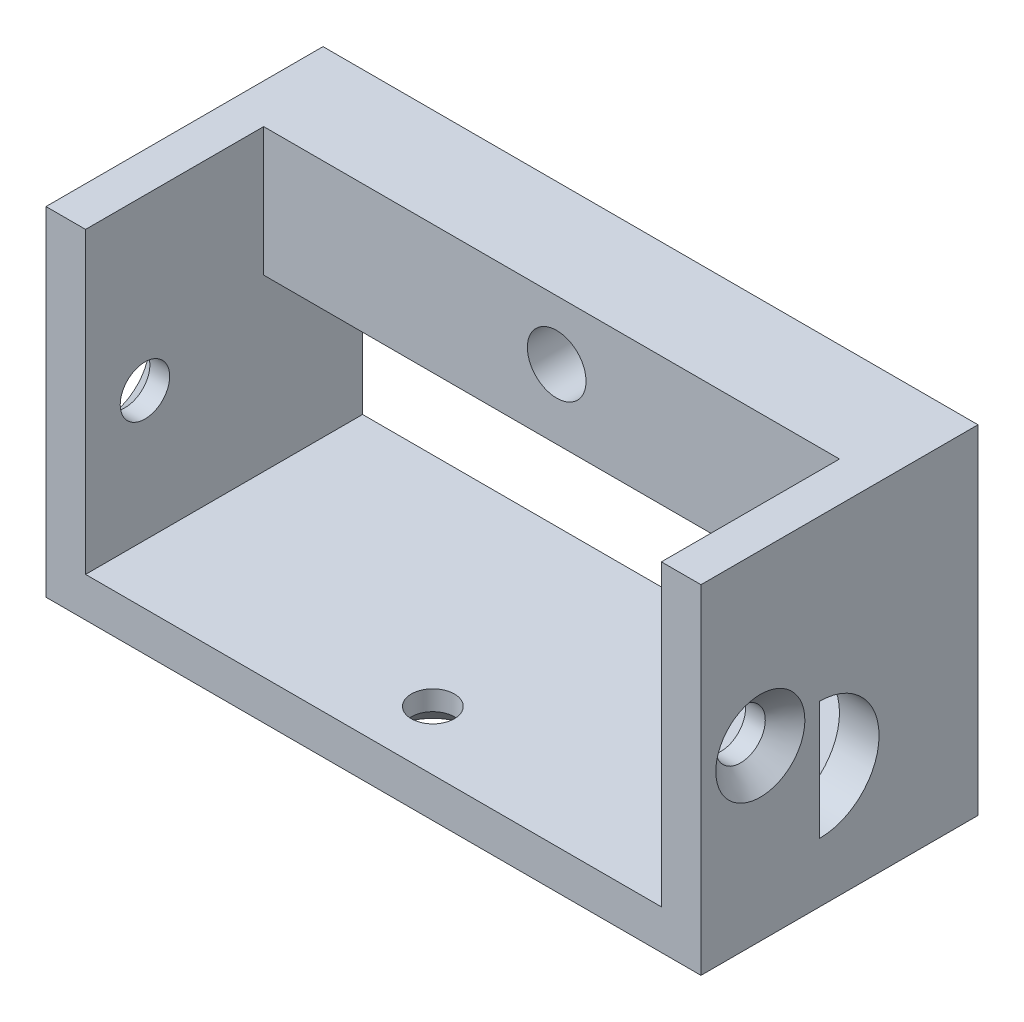
ISO-10303-21;
HEADER;
FILE_DESCRIPTION(('STEP AP214'),'2;1');
FILE_NAME('part.step','',(''),(''),'','','');
FILE_SCHEMA(('AUTOMOTIVE_DESIGN { 1 0 10303 214 1 1 1 1 }'));
ENDSEC;
DATA;
#1=APPLICATION_CONTEXT('core data for automotive mechanical design processes');
#2=APPLICATION_PROTOCOL_DEFINITION('international standard','automotive_design',2000,#1);
#3=PRODUCT_CONTEXT('',#1,'mechanical');
#4=PRODUCT('Part','Part','',(#3));
#5=PRODUCT_RELATED_PRODUCT_CATEGORY('part','',(#4));
#6=PRODUCT_DEFINITION_FORMATION('','',#4);
#7=PRODUCT_DEFINITION_CONTEXT('part definition',#1,'design');
#8=PRODUCT_DEFINITION('design','',#6,#7);
#9=PRODUCT_DEFINITION_SHAPE('','',#8);
#10=(LENGTH_UNIT() NAMED_UNIT(*) SI_UNIT(.MILLI.,.METRE.));
#11=(NAMED_UNIT(*) PLANE_ANGLE_UNIT() SI_UNIT($,.RADIAN.));
#12=(NAMED_UNIT(*) SI_UNIT($,.STERADIAN.) SOLID_ANGLE_UNIT());
#13=UNCERTAINTY_MEASURE_WITH_UNIT(LENGTH_MEASURE(1.E-05),#10,'distance_accuracy_value','');
#14=(GEOMETRIC_REPRESENTATION_CONTEXT(3) GLOBAL_UNCERTAINTY_ASSIGNED_CONTEXT((#13)) GLOBAL_UNIT_ASSIGNED_CONTEXT((#10,
#11,#12)) REPRESENTATION_CONTEXT('',''));
#15=CARTESIAN_POINT('',(0.,0.,0.));
#16=DIRECTION('',(0.,0.,1.));
#17=DIRECTION('',(1.,0.,0.));
#18=AXIS2_PLACEMENT_3D('',#15,#16,#17);
#19=CARTESIAN_POINT('',(0.,6.5,5.));
#20=DIRECTION('',(0.,-1.,0.));
#21=DIRECTION('',(1.,0.,0.));
#22=AXIS2_PLACEMENT_3D('',#19,#20,#21);
#23=PLANE('',#22);
#24=DIRECTION('',(-1.,0.,0.));
#25=VECTOR('',#24,1.);
#26=CARTESIAN_POINT('',(0.,6.5,0.));
#27=LINE('',#26,#25);
#28=CARTESIAN_POINT('',(2.,6.5,0.));
#29=VERTEX_POINT('',#28);
#30=CARTESIAN_POINT('',(-31.1,6.5,0.));
#31=VERTEX_POINT('',#30);
#32=EDGE_CURVE('E195',#29,#31,#27,.T.);
#33=ORIENTED_EDGE('',*,*,#32,.T.);
#34=DIRECTION('',(0.,0.,-1.));
#35=VECTOR('',#34,1.);
#36=CARTESIAN_POINT('',(-31.1,6.5,8.));
#37=LINE('',#36,#35);
#38=CARTESIAN_POINT('',(-31.1,6.5,14.));
#39=VERTEX_POINT('',#38);
#40=EDGE_CURVE('E192',#39,#31,#37,.T.);
#41=ORIENTED_EDGE('',*,*,#40,.F.);
#42=DIRECTION('',(-1.,0.,0.));
#43=VECTOR('',#42,1.);
#44=CARTESIAN_POINT('',(-31.1,6.5,14.));
#45=LINE('',#44,#43);
#46=CARTESIAN_POINT('',(-29.1,6.5,14.));
#47=VERTEX_POINT('',#46);
#48=EDGE_CURVE('E160',#47,#39,#45,.T.);
#49=ORIENTED_EDGE('',*,*,#48,.F.);
#50=DIRECTION('',(0.,0.,-1.));
#51=VECTOR('',#50,1.);
#52=CARTESIAN_POINT('',(-29.1,6.5,8.));
#53=LINE('',#52,#51);
#54=CARTESIAN_POINT('',(-29.1,6.5,5.));
#55=VERTEX_POINT('',#54);
#56=EDGE_CURVE('E203',#47,#55,#53,.T.);
#57=ORIENTED_EDGE('',*,*,#56,.T.);
#58=DIRECTION('',(-1.,0.,0.));
#59=VECTOR('',#58,1.);
#60=CARTESIAN_POINT('',(0.,6.5,5.));
#61=LINE('',#60,#59);
#62=CARTESIAN_POINT('',(0.,6.5,5.));
#63=VERTEX_POINT('',#62);
#64=EDGE_CURVE('E127',#63,#55,#61,.T.);
#65=ORIENTED_EDGE('',*,*,#64,.F.);
#66=DIRECTION('',(0.,0.,-1.));
#67=VECTOR('',#66,1.);
#68=CARTESIAN_POINT('',(0.,6.5,8.));
#69=LINE('',#68,#67);
#70=CARTESIAN_POINT('',(0.,6.5,14.));
#71=VERTEX_POINT('',#70);
#72=EDGE_CURVE('E121',#71,#63,#69,.T.);
#73=ORIENTED_EDGE('',*,*,#72,.F.);
#74=DIRECTION('',(-1.,0.,0.));
#75=VECTOR('',#74,1.);
#76=CARTESIAN_POINT('',(0.,6.5,14.));
#77=LINE('',#76,#75);
#78=CARTESIAN_POINT('',(2.,6.5,14.));
#79=VERTEX_POINT('',#78);
#80=EDGE_CURVE('E125',#79,#71,#77,.T.);
#81=ORIENTED_EDGE('',*,*,#80,.F.);
#82=DIRECTION('',(0.,0.,-1.));
#83=VECTOR('',#82,1.);
#84=CARTESIAN_POINT('',(2.,6.5,8.));
#85=LINE('',#84,#83);
#86=EDGE_CURVE('E130',#79,#29,#85,.T.);
#87=ORIENTED_EDGE('',*,*,#86,.T.);
#88=EDGE_LOOP('',(#33,#41,#49,#57,#65,#73,#81,#87));
#89=FACE_BOUND('',#88,.T.);
#90=ADVANCED_FACE('F36',(#89),#23,.F.);
#91=CARTESIAN_POINT('',(0.,0.,5.));
#92=DIRECTION('',(0.,1.,0.));
#93=DIRECTION('',(-1.,0.,0.));
#94=AXIS2_PLACEMENT_3D('',#91,#92,#93);
#95=PLANE('',#94);
#96=DIRECTION('',(1.,0.,0.));
#97=VECTOR('',#96,1.);
#98=CARTESIAN_POINT('',(0.,0.,0.));
#99=LINE('',#98,#97);
#100=CARTESIAN_POINT('',(-29.1,0.,0.));
#101=VERTEX_POINT('',#100);
#102=CARTESIAN_POINT('',(0.,0.,0.));
#103=VERTEX_POINT('',#102);
#104=EDGE_CURVE('E209',#101,#103,#99,.T.);
#105=ORIENTED_EDGE('',*,*,#104,.T.);
#106=DIRECTION('',(0.,0.,-1.));
#107=VECTOR('',#106,1.);
#108=CARTESIAN_POINT('',(0.,0.,5.));
#109=LINE('',#108,#107);
#110=CARTESIAN_POINT('',(0.,0.,5.));
#111=VERTEX_POINT('',#110);
#112=EDGE_CURVE('E214',#111,#103,#109,.T.);
#113=ORIENTED_EDGE('',*,*,#112,.F.);
#114=DIRECTION('',(1.,0.,0.));
#115=VECTOR('',#114,1.);
#116=CARTESIAN_POINT('',(0.,0.,5.));
#117=LINE('',#116,#115);
#118=CARTESIAN_POINT('',(-29.1,0.,5.));
#119=VERTEX_POINT('',#118);
#120=EDGE_CURVE('E52',#119,#111,#117,.T.);
#121=ORIENTED_EDGE('',*,*,#120,.F.);
#122=DIRECTION('',(0.,0.,-1.));
#123=VECTOR('',#122,1.);
#124=CARTESIAN_POINT('',(-29.1,0.,5.));
#125=LINE('',#124,#123);
#126=EDGE_CURVE('E220',#119,#101,#125,.T.);
#127=ORIENTED_EDGE('',*,*,#126,.T.);
#128=EDGE_LOOP('',(#105,#113,#121,#127));
#129=FACE_BOUND('',#128,.T.);
#130=ADVANCED_FACE('F266',(#129),#95,.F.);
#131=CARTESIAN_POINT('',(0.,0.,5.));
#132=DIRECTION('',(0.,0.,1.));
#133=DIRECTION('',(1.,0.,0.));
#134=AXIS2_PLACEMENT_3D('',#131,#132,#133);
#135=PLANE('',#134);
#136=CARTESIAN_POINT('',(-14.2908017761604,3.5,5.));
#137=DIRECTION('',(0.,0.,-1.));
#138=DIRECTION('',(-1.,0.,0.));
#139=AXIS2_PLACEMENT_3D('',#136,#137,#138);
#140=CIRCLE('',#139,1.48209069185977);
#141=CARTESIAN_POINT('',(-15.7728924680202,3.5,5.));
#142=VERTEX_POINT('',#141);
#143=EDGE_CURVE('E246',#142,#142,#140,.T.);
#144=ORIENTED_EDGE('',*,*,#143,.T.);
#145=EDGE_LOOP('',(#144));
#146=FACE_BOUND('',#145,.T.);
#147=DIRECTION('',(0.,1.,0.));
#148=VECTOR('',#147,1.);
#149=CARTESIAN_POINT('',(0.,0.,5.));
#150=LINE('',#149,#148);
#151=EDGE_CURVE('E207',#111,#63,#150,.T.);
#152=ORIENTED_EDGE('',*,*,#151,.T.);
#153=ORIENTED_EDGE('',*,*,#64,.T.);
#154=DIRECTION('',(0.,-1.,0.));
#155=VECTOR('',#154,1.);
#156=CARTESIAN_POINT('',(-29.1,0.,5.));
#157=LINE('',#156,#155);
#158=EDGE_CURVE('E211',#55,#119,#157,.T.);
#159=ORIENTED_EDGE('',*,*,#158,.T.);
#160=ORIENTED_EDGE('',*,*,#120,.T.);
#161=EDGE_LOOP('',(#152,#153,#159,#160));
#162=FACE_BOUND('',#161,.T.);
#163=ADVANCED_FACE('F271',(#146,#162),#135,.T.);
#164=CARTESIAN_POINT('',(0.,0.,0.));
#165=DIRECTION('',(0.,0.,1.));
#166=DIRECTION('',(1.,0.,0.));
#167=AXIS2_PLACEMENT_3D('',#164,#165,#166);
#168=PLANE('',#167);
#169=CARTESIAN_POINT('',(-14.2908017761604,3.5,0.));
#170=DIRECTION('',(0.,0.,1.));
#171=DIRECTION('',(1.,0.,0.));
#172=AXIS2_PLACEMENT_3D('',#169,#170,#171);
#173=CIRCLE('',#172,2.48209069185978);
#174=CARTESIAN_POINT('',(-11.8087110843006,3.5,0.));
#175=VERTEX_POINT('',#174);
#176=EDGE_CURVE('E11',#175,#175,#173,.T.);
#177=ORIENTED_EDGE('',*,*,#176,.T.);
#178=EDGE_LOOP('',(#177));
#179=FACE_BOUND('',#178,.T.);
#180=ORIENTED_EDGE('',*,*,#32,.F.);
#181=DIRECTION('',(0.,-1.,0.));
#182=VECTOR('',#181,1.);
#183=CARTESIAN_POINT('',(2.,0.,0.));
#184=LINE('',#183,#182);
#185=CARTESIAN_POINT('',(2.,-10.6,0.));
#186=VERTEX_POINT('',#185);
#187=EDGE_CURVE('E186',#29,#186,#184,.T.);
#188=ORIENTED_EDGE('',*,*,#187,.T.);
#189=DIRECTION('',(-1.,0.,0.));
#190=VECTOR('',#189,1.);
#191=CARTESIAN_POINT('',(0.,-10.6,0.));
#192=LINE('',#191,#190);
#193=CARTESIAN_POINT('',(-31.1,-10.6,0.));
#194=VERTEX_POINT('',#193);
#195=EDGE_CURVE('E189',#186,#194,#192,.T.);
#196=ORIENTED_EDGE('',*,*,#195,.T.);
#197=DIRECTION('',(0.,-1.,0.));
#198=VECTOR('',#197,1.);
#199=CARTESIAN_POINT('',(-31.1,0.,0.));
#200=LINE('',#199,#198);
#201=EDGE_CURVE('E176',#31,#194,#200,.T.);
#202=ORIENTED_EDGE('',*,*,#201,.F.);
#203=EDGE_LOOP('',(#180,#188,#196,#202));
#204=FACE_BOUND('',#203,.T.);
#205=DIRECTION('',(0.,-1.,0.));
#206=VECTOR('',#205,1.);
#207=CARTESIAN_POINT('',(0.,0.,0.));
#208=LINE('',#207,#206);
#209=CARTESIAN_POINT('',(0.,-8.6,0.));
#210=VERTEX_POINT('',#209);
#211=EDGE_CURVE('E184',#103,#210,#208,.T.);
#212=ORIENTED_EDGE('',*,*,#211,.F.);
#213=ORIENTED_EDGE('',*,*,#104,.F.);
#214=DIRECTION('',(0.,1.,0.));
#215=VECTOR('',#214,1.);
#216=CARTESIAN_POINT('',(-29.1,0.,0.));
#217=LINE('',#216,#215);
#218=CARTESIAN_POINT('',(-29.1,-8.6,0.));
#219=VERTEX_POINT('',#218);
#220=EDGE_CURVE('E179',#219,#101,#217,.T.);
#221=ORIENTED_EDGE('',*,*,#220,.F.);
#222=DIRECTION('',(-1.,0.,0.));
#223=VECTOR('',#222,1.);
#224=CARTESIAN_POINT('',(0.,-8.6,0.));
#225=LINE('',#224,#223);
#226=EDGE_CURVE('E182',#210,#219,#225,.T.);
#227=ORIENTED_EDGE('',*,*,#226,.F.);
#228=EDGE_LOOP('',(#212,#213,#221,#227));
#229=FACE_BOUND('',#228,.T.);
#230=ADVANCED_FACE('F312',(#179,#204,#229),#168,.F.);
#231=CARTESIAN_POINT('',(0.,0.,8.));
#232=DIRECTION('',(1.,0.,0.));
#233=DIRECTION('',(0.,1.,0.));
#234=AXIS2_PLACEMENT_3D('',#231,#232,#233);
#235=PLANE('',#234);
#236=CARTESIAN_POINT('',(0.,-2.05,11.));
#237=DIRECTION('',(1.,0.,0.));
#238=DIRECTION('',(0.,1.,0.));
#239=AXIS2_PLACEMENT_3D('',#236,#237,#238);
#240=CIRCLE('',#239,1.25);
#241=CARTESIAN_POINT('',(0.,-0.800000000000004,11.));
#242=VERTEX_POINT('',#241);
#243=EDGE_CURVE('E153',#242,#242,#240,.T.);
#244=ORIENTED_EDGE('',*,*,#243,.T.);
#245=EDGE_LOOP('',(#244));
#246=FACE_BOUND('',#245,.T.);
#247=CARTESIAN_POINT('',(0.,-4.60000000000001,8.));
#248=DIRECTION('',(1.,0.,0.));
#249=DIRECTION('',(0.,1.,0.));
#250=AXIS2_PLACEMENT_3D('',#247,#248,#249);
#251=CIRCLE('',#250,3.);
#252=CARTESIAN_POINT('',(0.,-7.60000000000001,8.));
#253=VERTEX_POINT('',#252);
#254=CARTESIAN_POINT('',(0.,-1.60000000000001,8.));
#255=VERTEX_POINT('',#254);
#256=EDGE_CURVE('E173',#253,#255,#251,.T.);
#257=ORIENTED_EDGE('',*,*,#256,.T.);
#258=DIRECTION('',(0.,-1.,0.));
#259=VECTOR('',#258,1.);
#260=CARTESIAN_POINT('',(0.,-8.6,8.));
#261=LINE('',#260,#259);
#262=EDGE_CURVE('E150',#255,#253,#261,.T.);
#263=ORIENTED_EDGE('',*,*,#262,.T.);
#264=EDGE_LOOP('',(#257,#263));
#265=FACE_BOUND('',#264,.T.);
#266=DIRECTION('',(0.,0.,-1.));
#267=VECTOR('',#266,1.);
#268=CARTESIAN_POINT('',(0.,-8.6,8.));
#269=LINE('',#268,#267);
#270=CARTESIAN_POINT('',(0.,-8.6,14.));
#271=VERTEX_POINT('',#270);
#272=EDGE_CURVE('E131',#271,#210,#269,.T.);
#273=ORIENTED_EDGE('',*,*,#272,.F.);
#274=DIRECTION('',(0.,-1.,0.));
#275=VECTOR('',#274,1.);
#276=CARTESIAN_POINT('',(0.,-8.6,14.));
#277=LINE('',#276,#275);
#278=EDGE_CURVE('E134',#71,#271,#277,.T.);
#279=ORIENTED_EDGE('',*,*,#278,.F.);
#280=ORIENTED_EDGE('',*,*,#72,.T.);
#281=ORIENTED_EDGE('',*,*,#151,.F.);
#282=ORIENTED_EDGE('',*,*,#112,.T.);
#283=ORIENTED_EDGE('',*,*,#211,.T.);
#284=EDGE_LOOP('',(#273,#279,#280,#281,#282,#283));
#285=FACE_BOUND('',#284,.T.);
#286=ADVANCED_FACE('F135',(#246,#265,#285),#235,.F.);
#287=CARTESIAN_POINT('',(-29.1,0.,8.));
#288=DIRECTION('',(-1.,0.,0.));
#289=DIRECTION('',(0.,0.,1.));
#290=AXIS2_PLACEMENT_3D('',#287,#288,#289);
#291=PLANE('',#290);
#292=CARTESIAN_POINT('',(-29.1,-2.05,11.));
#293=DIRECTION('',(-1.,0.,0.));
#294=DIRECTION('',(0.,0.,1.));
#295=AXIS2_PLACEMENT_3D('',#292,#293,#294);
#296=CIRCLE('',#295,1.25);
#297=CARTESIAN_POINT('',(-29.1,-2.05,12.25));
#298=VERTEX_POINT('',#297);
#299=EDGE_CURVE('E245',#298,#298,#296,.T.);
#300=ORIENTED_EDGE('',*,*,#299,.T.);
#301=EDGE_LOOP('',(#300));
#302=FACE_BOUND('',#301,.T.);
#303=ORIENTED_EDGE('',*,*,#220,.T.);
#304=ORIENTED_EDGE('',*,*,#126,.F.);
#305=ORIENTED_EDGE('',*,*,#158,.F.);
#306=ORIENTED_EDGE('',*,*,#56,.F.);
#307=DIRECTION('',(0.,1.,0.));
#308=VECTOR('',#307,1.);
#309=CARTESIAN_POINT('',(-29.1,6.5,14.));
#310=LINE('',#309,#308);
#311=CARTESIAN_POINT('',(-29.1,-8.6,14.));
#312=VERTEX_POINT('',#311);
#313=EDGE_CURVE('E157',#312,#47,#310,.T.);
#314=ORIENTED_EDGE('',*,*,#313,.F.);
#315=DIRECTION('',(0.,0.,-1.));
#316=VECTOR('',#315,1.);
#317=CARTESIAN_POINT('',(-29.1,-8.6,8.));
#318=LINE('',#317,#316);
#319=EDGE_CURVE('E200',#312,#219,#318,.T.);
#320=ORIENTED_EDGE('',*,*,#319,.T.);
#321=EDGE_LOOP('',(#303,#304,#305,#306,#314,#320));
#322=FACE_BOUND('',#321,.T.);
#323=ADVANCED_FACE('F310',(#302,#322),#291,.F.);
#324=CARTESIAN_POINT('',(-31.1,0.,8.));
#325=DIRECTION('',(1.,0.,0.));
#326=DIRECTION('',(0.,0.,-1.));
#327=AXIS2_PLACEMENT_3D('',#324,#325,#326);
#328=PLANE('',#327);
#329=CARTESIAN_POINT('',(-31.1,-2.05,11.));
#330=DIRECTION('',(1.,0.,0.));
#331=DIRECTION('',(0.,0.,-1.));
#332=AXIS2_PLACEMENT_3D('',#329,#330,#331);
#333=CIRCLE('',#332,2.25);
#334=CARTESIAN_POINT('',(-31.1,-2.05,8.75));
#335=VERTEX_POINT('',#334);
#336=EDGE_CURVE('E229',#335,#335,#333,.T.);
#337=ORIENTED_EDGE('',*,*,#336,.T.);
#338=EDGE_LOOP('',(#337));
#339=FACE_BOUND('',#338,.T.);
#340=ORIENTED_EDGE('',*,*,#201,.T.);
#341=DIRECTION('',(0.,0.,-1.));
#342=VECTOR('',#341,1.);
#343=CARTESIAN_POINT('',(-31.1,-10.6,8.));
#344=LINE('',#343,#342);
#345=CARTESIAN_POINT('',(-31.1,-10.6,14.));
#346=VERTEX_POINT('',#345);
#347=EDGE_CURVE('E193',#346,#194,#344,.T.);
#348=ORIENTED_EDGE('',*,*,#347,.F.);
#349=DIRECTION('',(0.,-1.,0.));
#350=VECTOR('',#349,1.);
#351=CARTESIAN_POINT('',(-31.1,-10.6,14.));
#352=LINE('',#351,#350);
#353=EDGE_CURVE('E163',#39,#346,#352,.T.);
#354=ORIENTED_EDGE('',*,*,#353,.F.);
#355=ORIENTED_EDGE('',*,*,#40,.T.);
#356=EDGE_LOOP('',(#340,#348,#354,#355));
#357=FACE_BOUND('',#356,.T.);
#358=ADVANCED_FACE('F318',(#339,#357),#328,.F.);
#359=CARTESIAN_POINT('',(0.,-10.6,8.));
#360=DIRECTION('',(0.,-1.,0.));
#361=DIRECTION('',(0.,0.,-1.));
#362=AXIS2_PLACEMENT_3D('',#359,#360,#361);
#363=PLANE('',#362);
#364=CARTESIAN_POINT('',(-14.55,-10.6,11.));
#365=DIRECTION('',(0.,-1.,0.));
#366=DIRECTION('',(0.,0.,-1.));
#367=AXIS2_PLACEMENT_3D('',#364,#365,#366);
#368=CIRCLE('',#367,2.08713416247847);
#369=CARTESIAN_POINT('',(-14.55,-10.6,8.91286583752153));
#370=VERTEX_POINT('',#369);
#371=EDGE_CURVE('E249',#370,#370,#368,.F.);
#372=ORIENTED_EDGE('',*,*,#371,.T.);
#373=EDGE_LOOP('',(#372));
#374=FACE_BOUND('',#373,.T.);
#375=ORIENTED_EDGE('',*,*,#195,.F.);
#376=DIRECTION('',(0.,0.,-1.));
#377=VECTOR('',#376,1.);
#378=CARTESIAN_POINT('',(2.,-10.6,8.));
#379=LINE('',#378,#377);
#380=CARTESIAN_POINT('',(2.,-10.6,14.));
#381=VERTEX_POINT('',#380);
#382=EDGE_CURVE('E196',#381,#186,#379,.T.);
#383=ORIENTED_EDGE('',*,*,#382,.F.);
#384=DIRECTION('',(1.,0.,0.));
#385=VECTOR('',#384,1.);
#386=CARTESIAN_POINT('',(2.,-10.6,14.));
#387=LINE('',#386,#385);
#388=EDGE_CURVE('E166',#346,#381,#387,.T.);
#389=ORIENTED_EDGE('',*,*,#388,.F.);
#390=ORIENTED_EDGE('',*,*,#347,.T.);
#391=EDGE_LOOP('',(#375,#383,#389,#390));
#392=FACE_BOUND('',#391,.T.);
#393=ADVANCED_FACE('F322',(#374,#392),#363,.T.);
#394=CARTESIAN_POINT('',(2.,0.,8.));
#395=DIRECTION('',(1.,0.,0.));
#396=DIRECTION('',(0.,1.,0.));
#397=AXIS2_PLACEMENT_3D('',#394,#395,#396);
#398=PLANE('',#397);
#399=CARTESIAN_POINT('',(2.,-2.05,11.));
#400=DIRECTION('',(1.,0.,0.));
#401=DIRECTION('',(0.,1.,0.));
#402=AXIS2_PLACEMENT_3D('',#399,#400,#401);
#403=CIRCLE('',#402,2.25000000000001);
#404=CARTESIAN_POINT('',(2.,0.200000000000009,11.));
#405=VERTEX_POINT('',#404);
#406=EDGE_CURVE('E238',#405,#405,#403,.F.);
#407=ORIENTED_EDGE('',*,*,#406,.T.);
#408=EDGE_LOOP('',(#407));
#409=FACE_BOUND('',#408,.T.);
#410=DIRECTION('',(0.,1.,0.));
#411=VECTOR('',#410,1.);
#412=CARTESIAN_POINT('',(2.,6.5,8.));
#413=LINE('',#412,#411);
#414=CARTESIAN_POINT('',(2.,-7.60000000000001,8.));
#415=VERTEX_POINT('',#414);
#416=CARTESIAN_POINT('',(2.,-1.60000000000001,8.));
#417=VERTEX_POINT('',#416);
#418=EDGE_CURVE('E147',#415,#417,#413,.T.);
#419=ORIENTED_EDGE('',*,*,#418,.T.);
#420=CARTESIAN_POINT('',(2.,-4.60000000000001,8.));
#421=DIRECTION('',(1.,0.,0.));
#422=DIRECTION('',(0.,1.,0.));
#423=AXIS2_PLACEMENT_3D('',#420,#421,#422);
#424=CIRCLE('',#423,3.);
#425=EDGE_CURVE('E169',#415,#417,#424,.T.);
#426=ORIENTED_EDGE('',*,*,#425,.F.);
#427=EDGE_LOOP('',(#419,#426));
#428=FACE_BOUND('',#427,.T.);
#429=ORIENTED_EDGE('',*,*,#86,.F.);
#430=DIRECTION('',(0.,1.,0.));
#431=VECTOR('',#430,1.);
#432=CARTESIAN_POINT('',(2.,6.5,14.));
#433=LINE('',#432,#431);
#434=EDGE_CURVE('E146',#381,#79,#433,.T.);
#435=ORIENTED_EDGE('',*,*,#434,.F.);
#436=ORIENTED_EDGE('',*,*,#382,.T.);
#437=ORIENTED_EDGE('',*,*,#187,.F.);
#438=EDGE_LOOP('',(#429,#435,#436,#437));
#439=FACE_BOUND('',#438,.T.);
#440=ADVANCED_FACE('F302',(#409,#428,#439),#398,.T.);
#441=CARTESIAN_POINT('',(0.,-8.6,8.));
#442=DIRECTION('',(0.,-1.,0.));
#443=DIRECTION('',(0.,0.,-1.));
#444=AXIS2_PLACEMENT_3D('',#441,#442,#443);
#445=PLANE('',#444);
#446=CARTESIAN_POINT('',(-14.55,-8.6,11.));
#447=DIRECTION('',(0.,-1.,0.));
#448=DIRECTION('',(0.,0.,-1.));
#449=AXIS2_PLACEMENT_3D('',#446,#447,#448);
#450=CIRCLE('',#449,1.08713416247846);
#451=CARTESIAN_POINT('',(-14.55,-8.6,9.91286583752154));
#452=VERTEX_POINT('',#451);
#453=EDGE_CURVE('E242',#452,#452,#450,.T.);
#454=ORIENTED_EDGE('',*,*,#453,.T.);
#455=EDGE_LOOP('',(#454));
#456=FACE_BOUND('',#455,.T.);
#457=ORIENTED_EDGE('',*,*,#226,.T.);
#458=ORIENTED_EDGE('',*,*,#319,.F.);
#459=DIRECTION('',(-1.,0.,0.));
#460=VECTOR('',#459,1.);
#461=CARTESIAN_POINT('',(-29.1,-8.6,14.));
#462=LINE('',#461,#460);
#463=EDGE_CURVE('E140',#271,#312,#462,.T.);
#464=ORIENTED_EDGE('',*,*,#463,.F.);
#465=ORIENTED_EDGE('',*,*,#272,.T.);
#466=EDGE_LOOP('',(#457,#458,#464,#465));
#467=FACE_BOUND('',#466,.T.);
#468=ADVANCED_FACE('F298',(#456,#467),#445,.F.);
#469=CARTESIAN_POINT('',(-1.,-4.60000000000001,8.));
#470=DIRECTION('',(1.,0.,0.));
#471=DIRECTION('',(0.,1.,0.));
#472=AXIS2_PLACEMENT_3D('',#469,#470,#471);
#473=CYLINDRICAL_SURFACE('',#472,3.);
#474=ORIENTED_EDGE('',*,*,#256,.F.);
#475=DIRECTION('',(1.,0.,0.));
#476=VECTOR('',#475,1.);
#477=CARTESIAN_POINT('',(-1.,-7.60000000000001,8.));
#478=LINE('',#477,#476);
#479=EDGE_CURVE('E223',#415,#253,#478,.F.);
#480=ORIENTED_EDGE('',*,*,#479,.F.);
#481=ORIENTED_EDGE('',*,*,#425,.T.);
#482=DIRECTION('',(1.,0.,0.));
#483=VECTOR('',#482,1.);
#484=CARTESIAN_POINT('',(-1.,-1.60000000000001,8.));
#485=LINE('',#484,#483);
#486=EDGE_CURVE('E226',#255,#417,#485,.T.);
#487=ORIENTED_EDGE('',*,*,#486,.F.);
#488=EDGE_LOOP('',(#474,#480,#481,#487));
#489=FACE_BOUND('',#488,.T.);
#490=ADVANCED_FACE('F301',(#489),#473,.F.);
#491=CARTESIAN_POINT('',(0.,0.,8.));
#492=DIRECTION('',(0.,0.,-1.));
#493=DIRECTION('',(-1.,0.,0.));
#494=AXIS2_PLACEMENT_3D('',#491,#492,#493);
#495=PLANE('',#494);
#496=ORIENTED_EDGE('',*,*,#486,.T.);
#497=ORIENTED_EDGE('',*,*,#418,.F.);
#498=ORIENTED_EDGE('',*,*,#479,.T.);
#499=ORIENTED_EDGE('',*,*,#262,.F.);
#500=EDGE_LOOP('',(#496,#497,#498,#499));
#501=FACE_BOUND('',#500,.T.);
#502=ADVANCED_FACE('F351',(#501),#495,.T.);
#503=CARTESIAN_POINT('',(0.,0.,14.));
#504=DIRECTION('',(0.,0.,-1.));
#505=DIRECTION('',(-1.,0.,0.));
#506=AXIS2_PLACEMENT_3D('',#503,#504,#505);
#507=PLANE('',#506);
#508=ORIENTED_EDGE('',*,*,#80,.T.);
#509=ORIENTED_EDGE('',*,*,#278,.T.);
#510=ORIENTED_EDGE('',*,*,#463,.T.);
#511=ORIENTED_EDGE('',*,*,#313,.T.);
#512=ORIENTED_EDGE('',*,*,#48,.T.);
#513=ORIENTED_EDGE('',*,*,#353,.T.);
#514=ORIENTED_EDGE('',*,*,#388,.T.);
#515=ORIENTED_EDGE('',*,*,#434,.T.);
#516=EDGE_LOOP('',(#508,#509,#510,#511,#512,#513,#514,#515));
#517=FACE_BOUND('',#516,.T.);
#518=ADVANCED_FACE('F143',(#517),#507,.F.);
#519=CARTESIAN_POINT('',(-31.1,-2.05,11.));
#520=DIRECTION('',(1.,0.,0.));
#521=DIRECTION('',(0.,1.,0.));
#522=AXIS2_PLACEMENT_3D('',#519,#520,#521);
#523=CYLINDRICAL_SURFACE('',#522,1.25);
#524=CARTESIAN_POINT('',(0.99999999999999,-2.05,11.));
#525=DIRECTION('',(1.,0.,0.));
#526=DIRECTION('',(0.,1.,0.));
#527=AXIS2_PLACEMENT_3D('',#524,#525,#526);
#528=CIRCLE('',#527,1.25);
#529=CARTESIAN_POINT('',(0.999999999999991,-0.800000000000004,11.));
#530=VERTEX_POINT('',#529);
#531=EDGE_CURVE('E235',#530,#530,#528,.T.);
#532=ORIENTED_EDGE('',*,*,#531,.T.);
#533=EDGE_LOOP('',(#532));
#534=FACE_BOUND('',#533,.T.);
#535=ORIENTED_EDGE('',*,*,#243,.F.);
#536=EDGE_LOOP('',(#535));
#537=FACE_BOUND('',#536,.T.);
#538=ADVANCED_FACE('F358',(#534,#537),#523,.F.);
#539=CARTESIAN_POINT('',(-30.1,-2.05,11.));
#540=DIRECTION('',(1.,0.,0.));
#541=DIRECTION('',(0.,1.,0.));
#542=AXIS2_PLACEMENT_3D('',#539,#540,#541);
#543=CIRCLE('',#542,1.25);
#544=CARTESIAN_POINT('',(-30.1,-0.799999999999997,11.));
#545=VERTEX_POINT('',#544);
#546=EDGE_CURVE('E232',#545,#545,#543,.F.);
#547=ORIENTED_EDGE('',*,*,#546,.T.);
#548=EDGE_LOOP('',(#547));
#549=FACE_BOUND('',#548,.T.);
#550=ORIENTED_EDGE('',*,*,#299,.F.);
#551=EDGE_LOOP('',(#550));
#552=FACE_BOUND('',#551,.T.);
#553=ADVANCED_FACE('F280',(#549,#552),#523,.F.);
#554=CARTESIAN_POINT('',(-31.1,-2.05,11.));
#555=DIRECTION('',(-1.,0.,0.));
#556=DIRECTION('',(0.,-1.,0.));
#557=AXIS2_PLACEMENT_3D('',#554,#555,#556);
#558=CONICAL_SURFACE('',#557,2.25,0.785398163397446);
#559=ORIENTED_EDGE('',*,*,#546,.F.);
#560=EDGE_LOOP('',(#559));
#561=FACE_BOUND('',#560,.T.);
#562=ORIENTED_EDGE('',*,*,#336,.F.);
#563=EDGE_LOOP('',(#562));
#564=FACE_BOUND('',#563,.T.);
#565=ADVANCED_FACE('F276',(#561,#564),#558,.F.);
#566=CARTESIAN_POINT('',(0.99999999999999,-2.05,11.));
#567=DIRECTION('',(1.,0.,0.));
#568=DIRECTION('',(0.,1.,0.));
#569=AXIS2_PLACEMENT_3D('',#566,#567,#568);
#570=CONICAL_SURFACE('',#569,1.25,0.785398163397451);
#571=ORIENTED_EDGE('',*,*,#406,.F.);
#572=EDGE_LOOP('',(#571));
#573=FACE_BOUND('',#572,.T.);
#574=ORIENTED_EDGE('',*,*,#531,.F.);
#575=EDGE_LOOP('',(#574));
#576=FACE_BOUND('',#575,.T.);
#577=ADVANCED_FACE('F279',(#573,#576),#570,.F.);
#578=CARTESIAN_POINT('',(-14.55,-5.6,11.));
#579=DIRECTION('',(0.,-1.,0.));
#580=DIRECTION('',(0.,0.,-1.));
#581=AXIS2_PLACEMENT_3D('',#578,#579,#580);
#582=CYLINDRICAL_SURFACE('',#581,1.08713416247846);
#583=CARTESIAN_POINT('',(-14.55,-9.6,11.));
#584=DIRECTION('',(0.,-1.,0.));
#585=DIRECTION('',(0.,0.,-1.));
#586=AXIS2_PLACEMENT_3D('',#583,#584,#585);
#587=CIRCLE('',#586,1.08713416247846);
#588=CARTESIAN_POINT('',(-14.55,-9.6,9.91286583752154));
#589=VERTEX_POINT('',#588);
#590=EDGE_CURVE('E241',#589,#589,#587,.T.);
#591=ORIENTED_EDGE('',*,*,#590,.T.);
#592=EDGE_LOOP('',(#591));
#593=FACE_BOUND('',#592,.T.);
#594=ORIENTED_EDGE('',*,*,#453,.F.);
#595=EDGE_LOOP('',(#594));
#596=FACE_BOUND('',#595,.T.);
#597=ADVANCED_FACE('F283',(#593,#596),#582,.F.);
#598=CARTESIAN_POINT('',(-14.55,-9.6,11.));
#599=DIRECTION('',(0.,-1.,0.));
#600=DIRECTION('',(0.,0.,-1.));
#601=AXIS2_PLACEMENT_3D('',#598,#599,#600);
#602=CONICAL_SURFACE('',#601,1.08713416247846,0.78539816339745);
#603=ORIENTED_EDGE('',*,*,#371,.F.);
#604=EDGE_LOOP('',(#603));
#605=FACE_BOUND('',#604,.T.);
#606=ORIENTED_EDGE('',*,*,#590,.F.);
#607=EDGE_LOOP('',(#606));
#608=FACE_BOUND('',#607,.T.);
#609=ADVANCED_FACE('F262',(#605,#608),#602,.F.);
#610=CARTESIAN_POINT('',(-14.2908017761604,3.5,5.));
#611=DIRECTION('',(0.,0.,-1.));
#612=DIRECTION('',(-1.,0.,0.));
#613=AXIS2_PLACEMENT_3D('',#610,#611,#612);
#614=CYLINDRICAL_SURFACE('',#613,1.48209069185977);
#615=CARTESIAN_POINT('',(-14.2908017761604,3.5,0.999999999999998));
#616=DIRECTION('',(0.,0.,1.));
#617=DIRECTION('',(1.,0.,0.));
#618=AXIS2_PLACEMENT_3D('',#615,#616,#617);
#619=CIRCLE('',#618,1.48209069185977);
#620=CARTESIAN_POINT('',(-12.8087110843006,3.5,0.999999999999998));
#621=VERTEX_POINT('',#620);
#622=EDGE_CURVE('E45',#621,#621,#619,.F.);
#623=ORIENTED_EDGE('',*,*,#622,.T.);
#624=EDGE_LOOP('',(#623));
#625=FACE_BOUND('',#624,.T.);
#626=ORIENTED_EDGE('',*,*,#143,.F.);
#627=EDGE_LOOP('',(#626));
#628=FACE_BOUND('',#627,.T.);
#629=ADVANCED_FACE('F254',(#625,#628),#614,.F.);
#630=CARTESIAN_POINT('',(-14.2908017761604,3.5,0.999999999999998));
#631=DIRECTION('',(0.,0.,-1.));
#632=DIRECTION('',(-1.,0.,0.));
#633=AXIS2_PLACEMENT_3D('',#630,#631,#632);
#634=CONICAL_SURFACE('',#633,1.48209069185977,0.785398163397451);
#635=ORIENTED_EDGE('',*,*,#176,.F.);
#636=EDGE_LOOP('',(#635));
#637=FACE_BOUND('',#636,.T.);
#638=ORIENTED_EDGE('',*,*,#622,.F.);
#639=EDGE_LOOP('',(#638));
#640=FACE_BOUND('',#639,.T.);
#641=ADVANCED_FACE('F38',(#637,#640),#634,.F.);
#642=CLOSED_SHELL('',(#90,#130,#163,#230,#286,#323,#358,#393,#440,#468,#490,#502,#518,#538,#553,
#565,#577,#597,#609,#629,#641));
#643=MANIFOLD_SOLID_BREP('B2',#642);
#644=ADVANCED_BREP_SHAPE_REPRESENTATION('',(#18,#643),#14);
#645=SHAPE_DEFINITION_REPRESENTATION(#9,#644);
ENDSEC;
END-ISO-10303-21;
